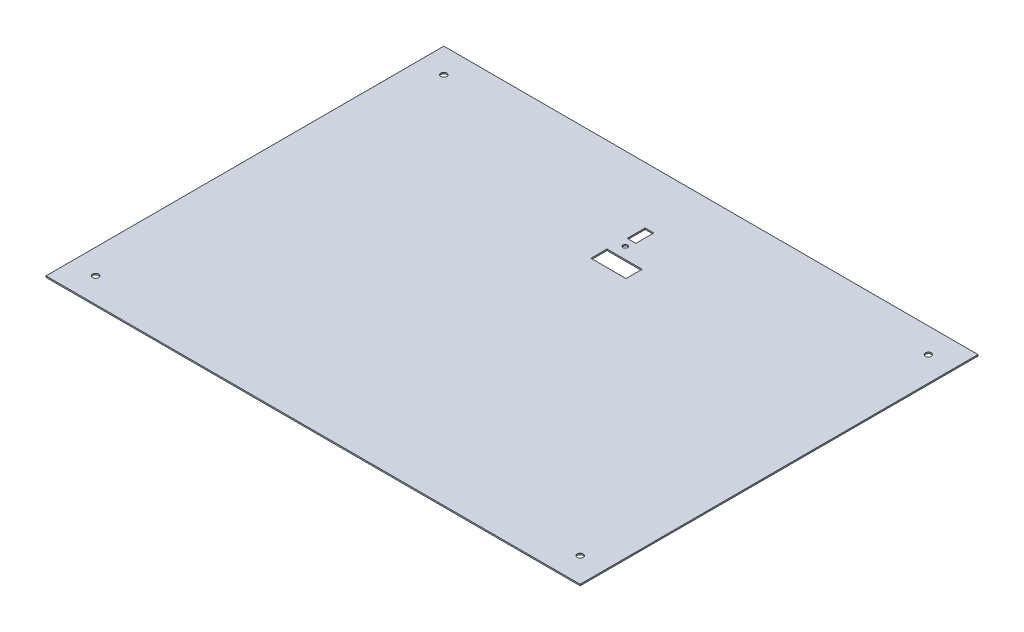
ISO-10303-21;
HEADER;
FILE_DESCRIPTION(('STEP AP214'),'2;1');
FILE_NAME('part.step','',(''),(''),'','','');
FILE_SCHEMA(('AUTOMOTIVE_DESIGN { 1 0 10303 214 1 1 1 1 }'));
ENDSEC;
DATA;
#1=APPLICATION_CONTEXT('core data for automotive mechanical design processes');
#2=APPLICATION_PROTOCOL_DEFINITION('international standard','automotive_design',2000,#1);
#3=PRODUCT_CONTEXT('',#1,'mechanical');
#4=PRODUCT('Part','Part','',(#3));
#5=PRODUCT_RELATED_PRODUCT_CATEGORY('part','',(#4));
#6=PRODUCT_DEFINITION_FORMATION('','',#4);
#7=PRODUCT_DEFINITION_CONTEXT('part definition',#1,'design');
#8=PRODUCT_DEFINITION('design','',#6,#7);
#9=PRODUCT_DEFINITION_SHAPE('','',#8);
#10=(LENGTH_UNIT() NAMED_UNIT(*) SI_UNIT(.MILLI.,.METRE.));
#11=(NAMED_UNIT(*) PLANE_ANGLE_UNIT() SI_UNIT($,.RADIAN.));
#12=(NAMED_UNIT(*) SI_UNIT($,.STERADIAN.) SOLID_ANGLE_UNIT());
#13=UNCERTAINTY_MEASURE_WITH_UNIT(LENGTH_MEASURE(1.E-05),#10,'distance_accuracy_value','');
#14=(GEOMETRIC_REPRESENTATION_CONTEXT(3) GLOBAL_UNCERTAINTY_ASSIGNED_CONTEXT((#13)) GLOBAL_UNIT_ASSIGNED_CONTEXT((#10,
#11,#12)) REPRESENTATION_CONTEXT('',''));
#15=CARTESIAN_POINT('',(0.,0.,0.));
#16=DIRECTION('',(0.,0.,1.));
#17=DIRECTION('',(1.,0.,0.));
#18=AXIS2_PLACEMENT_3D('',#15,#16,#17);
#19=CARTESIAN_POINT('',(0.,1.,0.));
#20=DIRECTION('',(0.,1.,0.));
#21=DIRECTION('',(0.,0.,1.));
#22=AXIS2_PLACEMENT_3D('',#19,#20,#21);
#23=PLANE('',#22);
#24=DIRECTION('',(0.,0.,1.));
#25=VECTOR('',#24,1.);
#26=CARTESIAN_POINT('',(-6.50615744248428,1.,-100.227524870356));
#27=LINE('',#26,#25);
#28=CARTESIAN_POINT('',(-6.50615744248428,1.,-100.227524870356));
#29=VERTEX_POINT('',#28);
#30=CARTESIAN_POINT('',(-6.50615744248428,1.,-87.1922335669361));
#31=VERTEX_POINT('',#30);
#32=EDGE_CURVE('E53',#29,#31,#27,.T.);
#33=ORIENTED_EDGE('',*,*,#32,.F.);
#34=DIRECTION('',(-1.,0.,0.));
#35=VECTOR('',#34,1.);
#36=CARTESIAN_POINT('',(-6.50615744248428,1.,-100.227524870356));
#37=LINE('',#36,#35);
#38=CARTESIAN_POINT('',(-0.256424744075057,1.,-100.227524870356));
#39=VERTEX_POINT('',#38);
#40=EDGE_CURVE('E136',#39,#29,#37,.T.);
#41=ORIENTED_EDGE('',*,*,#40,.F.);
#42=DIRECTION('',(0.,0.,-1.));
#43=VECTOR('',#42,1.);
#44=CARTESIAN_POINT('',(-0.256424744075057,1.,-100.227524870356));
#45=LINE('',#44,#43);
#46=CARTESIAN_POINT('',(-0.256424744075057,1.,-87.1922335669361));
#47=VERTEX_POINT('',#46);
#48=EDGE_CURVE('E157',#47,#39,#45,.T.);
#49=ORIENTED_EDGE('',*,*,#48,.F.);
#50=DIRECTION('',(1.,0.,0.));
#51=VECTOR('',#50,1.);
#52=CARTESIAN_POINT('',(-6.50615744248428,1.,-87.1922335669361));
#53=LINE('',#52,#51);
#54=EDGE_CURVE('E154',#31,#47,#53,.T.);
#55=ORIENTED_EDGE('',*,*,#54,.F.);
#56=EDGE_LOOP('',(#33,#41,#49,#55));
#57=FACE_BOUND('',#56,.T.);
#58=CARTESIAN_POINT('',(-2.15129632560396,1.,-81.5030310763037));
#59=DIRECTION('',(0.,1.,0.));
#60=DIRECTION('',(0.,0.,1.));
#61=AXIS2_PLACEMENT_3D('',#58,#59,#60);
#62=CIRCLE('',#61,1.69999999999443);
#63=CARTESIAN_POINT('',(-2.15129632560396,1.,-79.8030310763093));
#64=VERTEX_POINT('',#63);
#65=EDGE_CURVE('E171',#64,#64,#62,.T.);
#66=ORIENTED_EDGE('',*,*,#65,.F.);
#67=EDGE_LOOP('',(#66));
#68=FACE_BOUND('',#67,.T.);
#69=DIRECTION('',(0.,0.,1.));
#70=VECTOR('',#69,1.);
#71=CARTESIAN_POINT('',(-7.15129632560381,1.,-73.1557373300483));
#72=LINE('',#71,#70);
#73=CARTESIAN_POINT('',(-7.15129632560381,1.,-73.1557373300483));
#74=VERTEX_POINT('',#73);
#75=CARTESIAN_POINT('',(-7.15129632560381,1.,-61.5030310763036));
#76=VERTEX_POINT('',#75);
#77=EDGE_CURVE('E65',#74,#76,#72,.T.);
#78=ORIENTED_EDGE('',*,*,#77,.F.);
#79=DIRECTION('',(-1.,0.,0.));
#80=VECTOR('',#79,1.);
#81=CARTESIAN_POINT('',(-7.15129632560381,1.,-73.1557373300483));
#82=LINE('',#81,#80);
#83=CARTESIAN_POINT('',(18.3487036743962,1.,-73.1557373300483));
#84=VERTEX_POINT('',#83);
#85=EDGE_CURVE('E181',#84,#74,#82,.T.);
#86=ORIENTED_EDGE('',*,*,#85,.F.);
#87=DIRECTION('',(0.,0.,-1.));
#88=VECTOR('',#87,1.);
#89=CARTESIAN_POINT('',(18.3487036743962,1.,-73.1557373300483));
#90=LINE('',#89,#88);
#91=CARTESIAN_POINT('',(18.3487036743962,1.,-61.5030310763036));
#92=VERTEX_POINT('',#91);
#93=EDGE_CURVE('E186',#92,#84,#90,.T.);
#94=ORIENTED_EDGE('',*,*,#93,.F.);
#95=DIRECTION('',(1.,0.,0.));
#96=VECTOR('',#95,1.);
#97=CARTESIAN_POINT('',(-7.15129632560381,1.,-61.5030310763036));
#98=LINE('',#97,#96);
#99=EDGE_CURVE('E195',#76,#92,#98,.T.);
#100=ORIENTED_EDGE('',*,*,#99,.F.);
#101=EDGE_LOOP('',(#78,#86,#94,#100));
#102=FACE_BOUND('',#101,.T.);
#103=CARTESIAN_POINT('',(176.,1.,-123.5));
#104=DIRECTION('',(0.,1.,0.));
#105=DIRECTION('',(0.,0.,-1.));
#106=AXIS2_PLACEMENT_3D('',#103,#104,#105);
#107=CIRCLE('',#106,2.20000000000001);
#108=CARTESIAN_POINT('',(176.,1.,-125.7));
#109=VERTEX_POINT('',#108);
#110=EDGE_CURVE('E221',#109,#109,#107,.T.);
#111=ORIENTED_EDGE('',*,*,#110,.F.);
#112=EDGE_LOOP('',(#111));
#113=FACE_BOUND('',#112,.T.);
#114=CARTESIAN_POINT('',(-176.,1.,129.5));
#115=DIRECTION('',(0.,1.,0.));
#116=DIRECTION('',(0.,0.,1.));
#117=AXIS2_PLACEMENT_3D('',#114,#115,#116);
#118=CIRCLE('',#117,2.20000000000001);
#119=CARTESIAN_POINT('',(-176.,1.,131.7));
#120=VERTEX_POINT('',#119);
#121=EDGE_CURVE('E231',#120,#120,#118,.T.);
#122=ORIENTED_EDGE('',*,*,#121,.F.);
#123=EDGE_LOOP('',(#122));
#124=FACE_BOUND('',#123,.T.);
#125=DIRECTION('',(0.,0.,1.));
#126=VECTOR('',#125,1.);
#127=CARTESIAN_POINT('',(-194.,1.,141.5));
#128=LINE('',#127,#126);
#129=CARTESIAN_POINT('',(-194.,1.,-141.5));
#130=VERTEX_POINT('',#129);
#131=CARTESIAN_POINT('',(-194.,1.,147.5));
#132=VERTEX_POINT('',#131);
#133=EDGE_CURVE('E237',#130,#132,#128,.T.);
#134=ORIENTED_EDGE('',*,*,#133,.T.);
#135=DIRECTION('',(1.,0.,0.));
#136=VECTOR('',#135,1.);
#137=CARTESIAN_POINT('',(-194.,1.,147.5));
#138=LINE('',#137,#136);
#139=CARTESIAN_POINT('',(194.,1.,147.5));
#140=VERTEX_POINT('',#139);
#141=EDGE_CURVE('E144',#132,#140,#138,.T.);
#142=ORIENTED_EDGE('',*,*,#141,.T.);
#143=DIRECTION('',(0.,0.,-1.));
#144=VECTOR('',#143,1.);
#145=CARTESIAN_POINT('',(194.,1.,141.5));
#146=LINE('',#145,#144);
#147=CARTESIAN_POINT('',(194.,1.,-141.5));
#148=VERTEX_POINT('',#147);
#149=EDGE_CURVE('E241',#140,#148,#146,.T.);
#150=ORIENTED_EDGE('',*,*,#149,.T.);
#151=DIRECTION('',(-1.,0.,0.));
#152=VECTOR('',#151,1.);
#153=CARTESIAN_POINT('',(194.,1.,-141.5));
#154=LINE('',#153,#152);
#155=EDGE_CURVE('E242',#148,#130,#154,.T.);
#156=ORIENTED_EDGE('',*,*,#155,.T.);
#157=EDGE_LOOP('',(#134,#142,#150,#156));
#158=FACE_BOUND('',#157,.T.);
#159=CARTESIAN_POINT('',(-176.,1.,-123.5));
#160=DIRECTION('',(0.,1.,0.));
#161=DIRECTION('',(0.,0.,1.));
#162=AXIS2_PLACEMENT_3D('',#159,#160,#161);
#163=CIRCLE('',#162,2.20000000000001);
#164=CARTESIAN_POINT('',(-176.,1.,-121.3));
#165=VERTEX_POINT('',#164);
#166=EDGE_CURVE('E227',#165,#165,#163,.T.);
#167=ORIENTED_EDGE('',*,*,#166,.F.);
#168=EDGE_LOOP('',(#167));
#169=FACE_BOUND('',#168,.T.);
#170=CARTESIAN_POINT('',(176.,1.,129.5));
#171=DIRECTION('',(0.,1.,0.));
#172=DIRECTION('',(0.,0.,-1.));
#173=AXIS2_PLACEMENT_3D('',#170,#171,#172);
#174=CIRCLE('',#173,2.20000000000001);
#175=CARTESIAN_POINT('',(176.,1.,127.3));
#176=VERTEX_POINT('',#175);
#177=EDGE_CURVE('E214',#176,#176,#174,.T.);
#178=ORIENTED_EDGE('',*,*,#177,.F.);
#179=EDGE_LOOP('',(#178));
#180=FACE_BOUND('',#179,.T.);
#181=ADVANCED_FACE('F39',(#57,#68,#102,#113,#124,#158,#169,#180),#23,.T.);
#182=CARTESIAN_POINT('',(0.,0.,0.));
#183=DIRECTION('',(0.,1.,0.));
#184=DIRECTION('',(0.,0.,1.));
#185=AXIS2_PLACEMENT_3D('',#182,#183,#184);
#186=PLANE('',#185);
#187=DIRECTION('',(1.,0.,0.));
#188=VECTOR('',#187,1.);
#189=CARTESIAN_POINT('',(-6.50615744248428,0.,-100.227524870356));
#190=LINE('',#189,#188);
#191=CARTESIAN_POINT('',(-6.50615744248428,0.,-100.227524870356));
#192=VERTEX_POINT('',#191);
#193=CARTESIAN_POINT('',(-0.256424744075057,0.,-100.227524870356));
#194=VERTEX_POINT('',#193);
#195=EDGE_CURVE('E149',#192,#194,#190,.T.);
#196=ORIENTED_EDGE('',*,*,#195,.F.);
#197=DIRECTION('',(0.,0.,-1.));
#198=VECTOR('',#197,1.);
#199=CARTESIAN_POINT('',(-6.50615744248428,0.,-100.227524870356));
#200=LINE('',#199,#198);
#201=CARTESIAN_POINT('',(-6.50615744248428,0.,-87.1922335669361));
#202=VERTEX_POINT('',#201);
#203=EDGE_CURVE('E129',#202,#192,#200,.T.);
#204=ORIENTED_EDGE('',*,*,#203,.F.);
#205=DIRECTION('',(-1.,0.,0.));
#206=VECTOR('',#205,1.);
#207=CARTESIAN_POINT('',(-6.50615744248428,0.,-87.1922335669361));
#208=LINE('',#207,#206);
#209=CARTESIAN_POINT('',(-0.256424744075057,0.,-87.1922335669361));
#210=VERTEX_POINT('',#209);
#211=EDGE_CURVE('E139',#210,#202,#208,.T.);
#212=ORIENTED_EDGE('',*,*,#211,.F.);
#213=DIRECTION('',(0.,0.,1.));
#214=VECTOR('',#213,1.);
#215=CARTESIAN_POINT('',(-0.256424744075057,0.,-100.227524870356));
#216=LINE('',#215,#214);
#217=EDGE_CURVE('E155',#194,#210,#216,.T.);
#218=ORIENTED_EDGE('',*,*,#217,.F.);
#219=EDGE_LOOP('',(#196,#204,#212,#218));
#220=FACE_BOUND('',#219,.T.);
#221=CARTESIAN_POINT('',(-2.15129632560396,0.,-81.5030310763037));
#222=DIRECTION('',(0.,1.,0.));
#223=DIRECTION('',(0.,0.,1.));
#224=AXIS2_PLACEMENT_3D('',#221,#222,#223);
#225=CIRCLE('',#224,1.69999999999443);
#226=CARTESIAN_POINT('',(-2.15129632560396,0.,-79.8030310763093));
#227=VERTEX_POINT('',#226);
#228=EDGE_CURVE('E166',#227,#227,#225,.F.);
#229=ORIENTED_EDGE('',*,*,#228,.F.);
#230=EDGE_LOOP('',(#229));
#231=FACE_BOUND('',#230,.T.);
#232=DIRECTION('',(1.,0.,0.));
#233=VECTOR('',#232,1.);
#234=CARTESIAN_POINT('',(-7.15129632560381,0.,-73.1557373300483));
#235=LINE('',#234,#233);
#236=CARTESIAN_POINT('',(-7.15129632560381,0.,-73.1557373300483));
#237=VERTEX_POINT('',#236);
#238=CARTESIAN_POINT('',(18.3487036743962,0.,-73.1557373300483));
#239=VERTEX_POINT('',#238);
#240=EDGE_CURVE('E200',#237,#239,#235,.T.);
#241=ORIENTED_EDGE('',*,*,#240,.F.);
#242=DIRECTION('',(0.,0.,-1.));
#243=VECTOR('',#242,1.);
#244=CARTESIAN_POINT('',(-7.15129632560381,0.,-73.1557373300483));
#245=LINE('',#244,#243);
#246=CARTESIAN_POINT('',(-7.15129632560381,0.,-61.5030310763036));
#247=VERTEX_POINT('',#246);
#248=EDGE_CURVE('E198',#247,#237,#245,.T.);
#249=ORIENTED_EDGE('',*,*,#248,.F.);
#250=DIRECTION('',(-1.,0.,0.));
#251=VECTOR('',#250,1.);
#252=CARTESIAN_POINT('',(-7.15129632560381,0.,-61.5030310763036));
#253=LINE('',#252,#251);
#254=CARTESIAN_POINT('',(18.3487036743962,0.,-61.5030310763036));
#255=VERTEX_POINT('',#254);
#256=EDGE_CURVE('E174',#255,#247,#253,.T.);
#257=ORIENTED_EDGE('',*,*,#256,.F.);
#258=DIRECTION('',(0.,0.,1.));
#259=VECTOR('',#258,1.);
#260=CARTESIAN_POINT('',(18.3487036743962,0.,-73.1557373300483));
#261=LINE('',#260,#259);
#262=EDGE_CURVE('E175',#239,#255,#261,.T.);
#263=ORIENTED_EDGE('',*,*,#262,.F.);
#264=EDGE_LOOP('',(#241,#249,#257,#263));
#265=FACE_BOUND('',#264,.T.);
#266=DIRECTION('',(0.,0.,1.));
#267=VECTOR('',#266,1.);
#268=CARTESIAN_POINT('',(-194.,0.,141.5));
#269=LINE('',#268,#267);
#270=CARTESIAN_POINT('',(-194.,0.,-141.5));
#271=VERTEX_POINT('',#270);
#272=CARTESIAN_POINT('',(-194.,0.,147.5));
#273=VERTEX_POINT('',#272);
#274=EDGE_CURVE('E236',#271,#273,#269,.T.);
#275=ORIENTED_EDGE('',*,*,#274,.F.);
#276=DIRECTION('',(-1.,0.,0.));
#277=VECTOR('',#276,1.);
#278=CARTESIAN_POINT('',(194.,0.,-141.5));
#279=LINE('',#278,#277);
#280=CARTESIAN_POINT('',(194.,0.,-141.5));
#281=VERTEX_POINT('',#280);
#282=EDGE_CURVE('E245',#281,#271,#279,.T.);
#283=ORIENTED_EDGE('',*,*,#282,.F.);
#284=DIRECTION('',(0.,0.,-1.));
#285=VECTOR('',#284,1.);
#286=CARTESIAN_POINT('',(194.,0.,141.5));
#287=LINE('',#286,#285);
#288=CARTESIAN_POINT('',(194.,0.,147.5));
#289=VERTEX_POINT('',#288);
#290=EDGE_CURVE('E250',#289,#281,#287,.T.);
#291=ORIENTED_EDGE('',*,*,#290,.F.);
#292=DIRECTION('',(-1.,0.,0.));
#293=VECTOR('',#292,1.);
#294=CARTESIAN_POINT('',(-194.,0.,147.5));
#295=LINE('',#294,#293);
#296=EDGE_CURVE('E209',#289,#273,#295,.T.);
#297=ORIENTED_EDGE('',*,*,#296,.T.);
#298=EDGE_LOOP('',(#275,#283,#291,#297));
#299=FACE_BOUND('',#298,.T.);
#300=CARTESIAN_POINT('',(-176.,0.,129.5));
#301=DIRECTION('',(0.,1.,0.));
#302=DIRECTION('',(0.,0.,1.));
#303=AXIS2_PLACEMENT_3D('',#300,#301,#302);
#304=CIRCLE('',#303,2.20000000000001);
#305=CARTESIAN_POINT('',(-176.,0.,131.7));
#306=VERTEX_POINT('',#305);
#307=EDGE_CURVE('E229',#306,#306,#304,.T.);
#308=ORIENTED_EDGE('',*,*,#307,.T.);
#309=EDGE_LOOP('',(#308));
#310=FACE_BOUND('',#309,.T.);
#311=CARTESIAN_POINT('',(-176.,0.,-123.5));
#312=DIRECTION('',(0.,1.,0.));
#313=DIRECTION('',(0.,0.,1.));
#314=AXIS2_PLACEMENT_3D('',#311,#312,#313);
#315=CIRCLE('',#314,2.20000000000001);
#316=CARTESIAN_POINT('',(-176.,0.,-121.3));
#317=VERTEX_POINT('',#316);
#318=EDGE_CURVE('E222',#317,#317,#315,.T.);
#319=ORIENTED_EDGE('',*,*,#318,.T.);
#320=EDGE_LOOP('',(#319));
#321=FACE_BOUND('',#320,.T.);
#322=CARTESIAN_POINT('',(176.,0.,-123.5));
#323=DIRECTION('',(0.,1.,0.));
#324=DIRECTION('',(0.,0.,-1.));
#325=AXIS2_PLACEMENT_3D('',#322,#323,#324);
#326=CIRCLE('',#325,2.20000000000001);
#327=CARTESIAN_POINT('',(176.,0.,-125.7));
#328=VERTEX_POINT('',#327);
#329=EDGE_CURVE('E217',#328,#328,#326,.T.);
#330=ORIENTED_EDGE('',*,*,#329,.T.);
#331=EDGE_LOOP('',(#330));
#332=FACE_BOUND('',#331,.T.);
#333=CARTESIAN_POINT('',(176.,0.,129.5));
#334=DIRECTION('',(0.,1.,0.));
#335=DIRECTION('',(0.,0.,-1.));
#336=AXIS2_PLACEMENT_3D('',#333,#334,#335);
#337=CIRCLE('',#336,2.20000000000001);
#338=CARTESIAN_POINT('',(176.,0.,127.3));
#339=VERTEX_POINT('',#338);
#340=EDGE_CURVE('E213',#339,#339,#337,.T.);
#341=ORIENTED_EDGE('',*,*,#340,.T.);
#342=EDGE_LOOP('',(#341));
#343=FACE_BOUND('',#342,.T.);
#344=ADVANCED_FACE('F150',(#220,#231,#265,#299,#310,#321,#332,#343),#186,.F.);
#345=CARTESIAN_POINT('',(-194.,1.,141.5));
#346=DIRECTION('',(1.,0.,0.));
#347=DIRECTION('',(0.,0.,-1.));
#348=AXIS2_PLACEMENT_3D('',#345,#346,#347);
#349=PLANE('',#348);
#350=ORIENTED_EDGE('',*,*,#274,.T.);
#351=DIRECTION('',(0.,1.,0.));
#352=VECTOR('',#351,1.);
#353=CARTESIAN_POINT('',(-194.,-388.046388979462,147.5));
#354=LINE('',#353,#352);
#355=EDGE_CURVE('E204',#273,#132,#354,.T.);
#356=ORIENTED_EDGE('',*,*,#355,.T.);
#357=ORIENTED_EDGE('',*,*,#133,.F.);
#358=DIRECTION('',(0.,-1.,0.));
#359=VECTOR('',#358,1.);
#360=CARTESIAN_POINT('',(-194.,1.,-141.5));
#361=LINE('',#360,#359);
#362=EDGE_CURVE('E50',#130,#271,#361,.T.);
#363=ORIENTED_EDGE('',*,*,#362,.T.);
#364=EDGE_LOOP('',(#350,#356,#357,#363));
#365=FACE_BOUND('',#364,.T.);
#366=ADVANCED_FACE('F41',(#365),#349,.F.);
#367=CARTESIAN_POINT('',(194.,1.,141.5));
#368=DIRECTION('',(-1.,0.,0.));
#369=DIRECTION('',(0.,0.,1.));
#370=AXIS2_PLACEMENT_3D('',#367,#368,#369);
#371=PLANE('',#370);
#372=ORIENTED_EDGE('',*,*,#290,.T.);
#373=DIRECTION('',(0.,-1.,0.));
#374=VECTOR('',#373,1.);
#375=CARTESIAN_POINT('',(194.,1.,-141.5));
#376=LINE('',#375,#374);
#377=EDGE_CURVE('E11',#148,#281,#376,.T.);
#378=ORIENTED_EDGE('',*,*,#377,.F.);
#379=ORIENTED_EDGE('',*,*,#149,.F.);
#380=DIRECTION('',(0.,1.,0.));
#381=VECTOR('',#380,1.);
#382=CARTESIAN_POINT('',(194.,-388.046388979462,147.5));
#383=LINE('',#382,#381);
#384=EDGE_CURVE('E207',#289,#140,#383,.T.);
#385=ORIENTED_EDGE('',*,*,#384,.F.);
#386=EDGE_LOOP('',(#372,#378,#379,#385));
#387=FACE_BOUND('',#386,.T.);
#388=ADVANCED_FACE('F269',(#387),#371,.F.);
#389=CARTESIAN_POINT('',(194.,1.,-141.5));
#390=DIRECTION('',(0.,0.,1.));
#391=DIRECTION('',(1.,0.,0.));
#392=AXIS2_PLACEMENT_3D('',#389,#390,#391);
#393=PLANE('',#392);
#394=ORIENTED_EDGE('',*,*,#282,.T.);
#395=ORIENTED_EDGE('',*,*,#362,.F.);
#396=ORIENTED_EDGE('',*,*,#155,.F.);
#397=ORIENTED_EDGE('',*,*,#377,.T.);
#398=EDGE_LOOP('',(#394,#395,#396,#397));
#399=FACE_BOUND('',#398,.T.);
#400=ADVANCED_FACE('F268',(#399),#393,.F.);
#401=CARTESIAN_POINT('',(-176.,1.,129.5));
#402=DIRECTION('',(0.,-1.,0.));
#403=DIRECTION('',(0.,0.,-1.));
#404=AXIS2_PLACEMENT_3D('',#401,#402,#403);
#405=CYLINDRICAL_SURFACE('',#404,2.20000000000001);
#406=ORIENTED_EDGE('',*,*,#121,.T.);
#407=EDGE_LOOP('',(#406));
#408=FACE_BOUND('',#407,.T.);
#409=ORIENTED_EDGE('',*,*,#307,.F.);
#410=EDGE_LOOP('',(#409));
#411=FACE_BOUND('',#410,.T.);
#412=ADVANCED_FACE('F280',(#408,#411),#405,.F.);
#413=CARTESIAN_POINT('',(-176.,1.,-123.5));
#414=DIRECTION('',(0.,-1.,0.));
#415=DIRECTION('',(0.,0.,-1.));
#416=AXIS2_PLACEMENT_3D('',#413,#414,#415);
#417=CYLINDRICAL_SURFACE('',#416,2.20000000000001);
#418=ORIENTED_EDGE('',*,*,#166,.T.);
#419=EDGE_LOOP('',(#418));
#420=FACE_BOUND('',#419,.T.);
#421=ORIENTED_EDGE('',*,*,#318,.F.);
#422=EDGE_LOOP('',(#421));
#423=FACE_BOUND('',#422,.T.);
#424=ADVANCED_FACE('F289',(#420,#423),#417,.F.);
#425=CARTESIAN_POINT('',(176.,1.,-123.5));
#426=DIRECTION('',(0.,-1.,0.));
#427=DIRECTION('',(0.,0.,-1.));
#428=AXIS2_PLACEMENT_3D('',#425,#426,#427);
#429=CYLINDRICAL_SURFACE('',#428,2.20000000000001);
#430=ORIENTED_EDGE('',*,*,#110,.T.);
#431=EDGE_LOOP('',(#430));
#432=FACE_BOUND('',#431,.T.);
#433=ORIENTED_EDGE('',*,*,#329,.F.);
#434=EDGE_LOOP('',(#433));
#435=FACE_BOUND('',#434,.T.);
#436=ADVANCED_FACE('F295',(#432,#435),#429,.F.);
#437=CARTESIAN_POINT('',(176.,1.,129.5));
#438=DIRECTION('',(0.,-1.,0.));
#439=DIRECTION('',(0.,0.,-1.));
#440=AXIS2_PLACEMENT_3D('',#437,#438,#439);
#441=CYLINDRICAL_SURFACE('',#440,2.20000000000001);
#442=ORIENTED_EDGE('',*,*,#177,.T.);
#443=EDGE_LOOP('',(#442));
#444=FACE_BOUND('',#443,.T.);
#445=ORIENTED_EDGE('',*,*,#340,.F.);
#446=EDGE_LOOP('',(#445));
#447=FACE_BOUND('',#446,.T.);
#448=ADVANCED_FACE('F296',(#444,#447),#441,.F.);
#449=CARTESIAN_POINT('',(-194.,-388.046388979462,147.5));
#450=DIRECTION('',(0.,0.,1.));
#451=DIRECTION('',(1.,0.,0.));
#452=AXIS2_PLACEMENT_3D('',#449,#450,#451);
#453=PLANE('',#452);
#454=ORIENTED_EDGE('',*,*,#296,.F.);
#455=ORIENTED_EDGE('',*,*,#384,.T.);
#456=ORIENTED_EDGE('',*,*,#141,.F.);
#457=ORIENTED_EDGE('',*,*,#355,.F.);
#458=EDGE_LOOP('',(#454,#455,#456,#457));
#459=FACE_BOUND('',#458,.T.);
#460=ADVANCED_FACE('F265',(#459),#453,.T.);
#461=CARTESIAN_POINT('',(-7.15129632560381,-0.000999999999999916,-73.1557373300483));
#462=DIRECTION('',(-1.,0.,0.));
#463=DIRECTION('',(0.,0.,1.));
#464=AXIS2_PLACEMENT_3D('',#461,#462,#463);
#465=PLANE('',#464);
#466=ORIENTED_EDGE('',*,*,#248,.T.);
#467=DIRECTION('',(0.,1.,0.));
#468=VECTOR('',#467,1.);
#469=CARTESIAN_POINT('',(-7.15129632560381,-0.000999999999999916,-73.1557373300483));
#470=LINE('',#469,#468);
#471=EDGE_CURVE('E178',#237,#74,#470,.T.);
#472=ORIENTED_EDGE('',*,*,#471,.T.);
#473=ORIENTED_EDGE('',*,*,#77,.T.);
#474=DIRECTION('',(0.,1.,0.));
#475=VECTOR('',#474,1.);
#476=CARTESIAN_POINT('',(-7.15129632560381,-0.000999999999999916,-61.5030310763036));
#477=LINE('',#476,#475);
#478=EDGE_CURVE('E177',#247,#76,#477,.T.);
#479=ORIENTED_EDGE('',*,*,#478,.F.);
#480=EDGE_LOOP('',(#466,#472,#473,#479));
#481=FACE_BOUND('',#480,.T.);
#482=ADVANCED_FACE('F302',(#481),#465,.F.);
#483=CARTESIAN_POINT('',(-7.15129632560381,-0.000999999999999916,-73.1557373300483));
#484=DIRECTION('',(0.,0.,-1.));
#485=DIRECTION('',(-1.,0.,0.));
#486=AXIS2_PLACEMENT_3D('',#483,#484,#485);
#487=PLANE('',#486);
#488=ORIENTED_EDGE('',*,*,#240,.T.);
#489=DIRECTION('',(0.,1.,0.));
#490=VECTOR('',#489,1.);
#491=CARTESIAN_POINT('',(18.3487036743962,-0.000999999999999916,-73.1557373300483));
#492=LINE('',#491,#490);
#493=EDGE_CURVE('E183',#239,#84,#492,.T.);
#494=ORIENTED_EDGE('',*,*,#493,.T.);
#495=ORIENTED_EDGE('',*,*,#85,.T.);
#496=ORIENTED_EDGE('',*,*,#471,.F.);
#497=EDGE_LOOP('',(#488,#494,#495,#496));
#498=FACE_BOUND('',#497,.T.);
#499=ADVANCED_FACE('F304',(#498),#487,.F.);
#500=CARTESIAN_POINT('',(18.3487036743962,-0.000999999999999916,-73.1557373300483));
#501=DIRECTION('',(1.,0.,0.));
#502=DIRECTION('',(0.,0.,-1.));
#503=AXIS2_PLACEMENT_3D('',#500,#501,#502);
#504=PLANE('',#503);
#505=ORIENTED_EDGE('',*,*,#262,.T.);
#506=DIRECTION('',(0.,1.,0.));
#507=VECTOR('',#506,1.);
#508=CARTESIAN_POINT('',(18.3487036743962,-0.000999999999999916,-61.5030310763036));
#509=LINE('',#508,#507);
#510=EDGE_CURVE('E185',#255,#92,#509,.T.);
#511=ORIENTED_EDGE('',*,*,#510,.T.);
#512=ORIENTED_EDGE('',*,*,#93,.T.);
#513=ORIENTED_EDGE('',*,*,#493,.F.);
#514=EDGE_LOOP('',(#505,#511,#512,#513));
#515=FACE_BOUND('',#514,.T.);
#516=ADVANCED_FACE('F308',(#515),#504,.F.);
#517=CARTESIAN_POINT('',(-7.15129632560381,-0.000999999999999916,-61.5030310763036));
#518=DIRECTION('',(0.,0.,1.));
#519=DIRECTION('',(1.,0.,0.));
#520=AXIS2_PLACEMENT_3D('',#517,#518,#519);
#521=PLANE('',#520);
#522=ORIENTED_EDGE('',*,*,#256,.T.);
#523=ORIENTED_EDGE('',*,*,#478,.T.);
#524=ORIENTED_EDGE('',*,*,#99,.T.);
#525=ORIENTED_EDGE('',*,*,#510,.F.);
#526=EDGE_LOOP('',(#522,#523,#524,#525));
#527=FACE_BOUND('',#526,.T.);
#528=ADVANCED_FACE('F315',(#527),#521,.F.);
#529=CARTESIAN_POINT('',(-2.15129632560396,-0.000999999999999916,-81.5030310763037));
#530=DIRECTION('',(0.,1.,0.));
#531=DIRECTION('',(0.,0.,1.));
#532=AXIS2_PLACEMENT_3D('',#529,#530,#531);
#533=CYLINDRICAL_SURFACE('',#532,1.69999999999443);
#534=ORIENTED_EDGE('',*,*,#65,.T.);
#535=EDGE_LOOP('',(#534));
#536=FACE_BOUND('',#535,.T.);
#537=ORIENTED_EDGE('',*,*,#228,.T.);
#538=EDGE_LOOP('',(#537));
#539=FACE_BOUND('',#538,.T.);
#540=ADVANCED_FACE('F317',(#536,#539),#533,.F.);
#541=CARTESIAN_POINT('',(-6.50615744248428,-0.000999999999999916,-100.227524870356));
#542=DIRECTION('',(-1.,0.,0.));
#543=DIRECTION('',(0.,0.,1.));
#544=AXIS2_PLACEMENT_3D('',#541,#542,#543);
#545=PLANE('',#544);
#546=ORIENTED_EDGE('',*,*,#203,.T.);
#547=DIRECTION('',(0.,1.,0.));
#548=VECTOR('',#547,1.);
#549=CARTESIAN_POINT('',(-6.50615744248428,-0.000999999999999916,-100.227524870356));
#550=LINE('',#549,#548);
#551=EDGE_CURVE('E143',#192,#29,#550,.T.);
#552=ORIENTED_EDGE('',*,*,#551,.T.);
#553=ORIENTED_EDGE('',*,*,#32,.T.);
#554=DIRECTION('',(0.,1.,0.));
#555=VECTOR('',#554,1.);
#556=CARTESIAN_POINT('',(-6.50615744248428,-0.000999999999999916,-87.1922335669361));
#557=LINE('',#556,#555);
#558=EDGE_CURVE('E126',#202,#31,#557,.T.);
#559=ORIENTED_EDGE('',*,*,#558,.F.);
#560=EDGE_LOOP('',(#546,#552,#553,#559));
#561=FACE_BOUND('',#560,.T.);
#562=ADVANCED_FACE('F127',(#561),#545,.F.);
#563=CARTESIAN_POINT('',(-6.50615744248428,-0.000999999999999916,-100.227524870356));
#564=DIRECTION('',(0.,0.,-1.));
#565=DIRECTION('',(-1.,0.,0.));
#566=AXIS2_PLACEMENT_3D('',#563,#564,#565);
#567=PLANE('',#566);
#568=ORIENTED_EDGE('',*,*,#195,.T.);
#569=DIRECTION('',(0.,1.,0.));
#570=VECTOR('',#569,1.);
#571=CARTESIAN_POINT('',(-0.256424744075057,-0.000999999999999916,-100.227524870356));
#572=LINE('',#571,#570);
#573=EDGE_CURVE('E164',#194,#39,#572,.T.);
#574=ORIENTED_EDGE('',*,*,#573,.T.);
#575=ORIENTED_EDGE('',*,*,#40,.T.);
#576=ORIENTED_EDGE('',*,*,#551,.F.);
#577=EDGE_LOOP('',(#568,#574,#575,#576));
#578=FACE_BOUND('',#577,.T.);
#579=ADVANCED_FACE('F324',(#578),#567,.F.);
#580=CARTESIAN_POINT('',(-0.256424744075057,-0.000999999999999916,-100.227524870356));
#581=DIRECTION('',(1.,0.,0.));
#582=DIRECTION('',(0.,0.,-1.));
#583=AXIS2_PLACEMENT_3D('',#580,#581,#582);
#584=PLANE('',#583);
#585=ORIENTED_EDGE('',*,*,#217,.T.);
#586=DIRECTION('',(0.,1.,0.));
#587=VECTOR('',#586,1.);
#588=CARTESIAN_POINT('',(-0.256424744075057,-0.000999999999999916,-87.1922335669361));
#589=LINE('',#588,#587);
#590=EDGE_CURVE('E131',#210,#47,#589,.T.);
#591=ORIENTED_EDGE('',*,*,#590,.T.);
#592=ORIENTED_EDGE('',*,*,#48,.T.);
#593=ORIENTED_EDGE('',*,*,#573,.F.);
#594=EDGE_LOOP('',(#585,#591,#592,#593));
#595=FACE_BOUND('',#594,.T.);
#596=ADVANCED_FACE('F327',(#595),#584,.F.);
#597=CARTESIAN_POINT('',(-6.50615744248428,-0.000999999999999916,-87.1922335669361));
#598=DIRECTION('',(0.,0.,1.));
#599=DIRECTION('',(1.,0.,0.));
#600=AXIS2_PLACEMENT_3D('',#597,#598,#599);
#601=PLANE('',#600);
#602=ORIENTED_EDGE('',*,*,#211,.T.);
#603=ORIENTED_EDGE('',*,*,#558,.T.);
#604=ORIENTED_EDGE('',*,*,#54,.T.);
#605=ORIENTED_EDGE('',*,*,#590,.F.);
#606=EDGE_LOOP('',(#602,#603,#604,#605));
#607=FACE_BOUND('',#606,.T.);
#608=ADVANCED_FACE('F142',(#607),#601,.F.);
#609=CLOSED_SHELL('',(#181,#344,#366,#388,#400,#412,#424,#436,#448,#460,#482,#499,#516,#528,
#540,#562,#579,#596,#608));
#610=MANIFOLD_SOLID_BREP('B2',#609);
#611=ADVANCED_BREP_SHAPE_REPRESENTATION('',(#18,#610),#14);
#612=SHAPE_DEFINITION_REPRESENTATION(#9,#611);
ENDSEC;
END-ISO-10303-21;
